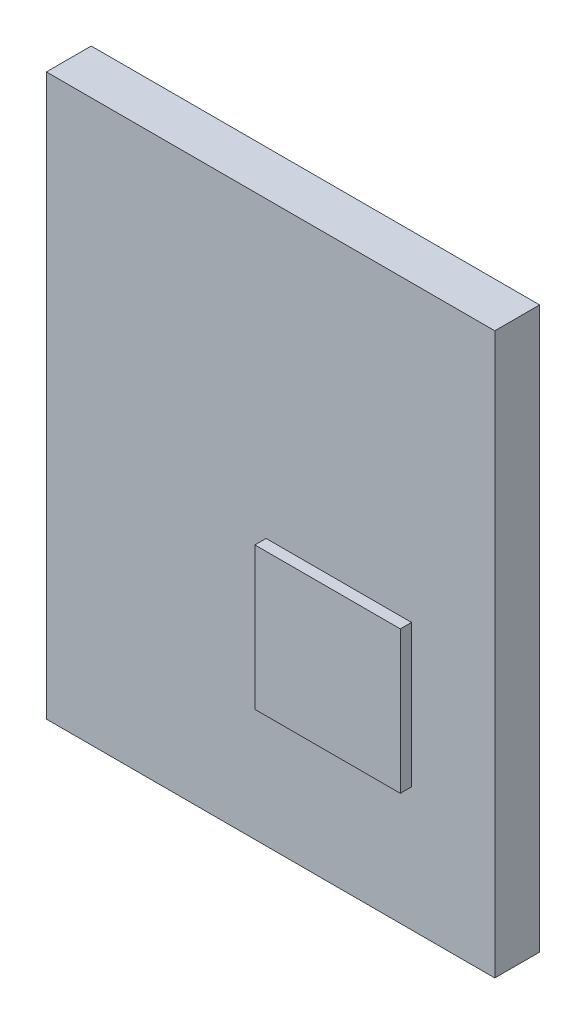
ISO-10303-21;
HEADER;
FILE_DESCRIPTION(('STEP AP214'),'2;1');
FILE_NAME('part.step','',(''),(''),'','','');
FILE_SCHEMA(('AUTOMOTIVE_DESIGN { 1 0 10303 214 1 1 1 1 }'));
ENDSEC;
DATA;
#1=APPLICATION_CONTEXT('core data for automotive mechanical design processes');
#2=APPLICATION_PROTOCOL_DEFINITION('international standard','automotive_design',2000,#1);
#3=PRODUCT_CONTEXT('',#1,'mechanical');
#4=PRODUCT('Part','Part','',(#3));
#5=PRODUCT_RELATED_PRODUCT_CATEGORY('part','',(#4));
#6=PRODUCT_DEFINITION_FORMATION('','',#4);
#7=PRODUCT_DEFINITION_CONTEXT('part definition',#1,'design');
#8=PRODUCT_DEFINITION('design','',#6,#7);
#9=PRODUCT_DEFINITION_SHAPE('','',#8);
#10=(LENGTH_UNIT() NAMED_UNIT(*) SI_UNIT(.MILLI.,.METRE.));
#11=(NAMED_UNIT(*) PLANE_ANGLE_UNIT() SI_UNIT($,.RADIAN.));
#12=(NAMED_UNIT(*) SI_UNIT($,.STERADIAN.) SOLID_ANGLE_UNIT());
#13=UNCERTAINTY_MEASURE_WITH_UNIT(LENGTH_MEASURE(1.E-05),#10,'distance_accuracy_value','');
#14=(GEOMETRIC_REPRESENTATION_CONTEXT(3) GLOBAL_UNCERTAINTY_ASSIGNED_CONTEXT((#13)) GLOBAL_UNIT_ASSIGNED_CONTEXT((#10,
#11,#12)) REPRESENTATION_CONTEXT('',''));
#15=CARTESIAN_POINT('',(0.,0.,0.));
#16=DIRECTION('',(0.,0.,1.));
#17=DIRECTION('',(1.,0.,0.));
#18=AXIS2_PLACEMENT_3D('',#15,#16,#17);
#19=CARTESIAN_POINT('',(0.,0.,2.));
#20=DIRECTION('',(0.,0.,1.));
#21=DIRECTION('',(1.,0.,0.));
#22=AXIS2_PLACEMENT_3D('',#19,#20,#21);
#23=PLANE('',#22);
#24=DIRECTION('',(0.,-1.,0.));
#25=VECTOR('',#24,1.);
#26=CARTESIAN_POINT('',(-10.,-12.5,2.));
#27=LINE('',#26,#25);
#28=CARTESIAN_POINT('',(-10.,12.5,2.));
#29=VERTEX_POINT('',#28);
#30=CARTESIAN_POINT('',(-10.,-12.5,2.));
#31=VERTEX_POINT('',#30);
#32=EDGE_CURVE('E152',#29,#31,#27,.T.);
#33=ORIENTED_EDGE('',*,*,#32,.T.);
#34=DIRECTION('',(1.,0.,0.));
#35=VECTOR('',#34,1.);
#36=CARTESIAN_POINT('',(10.,-12.5,2.));
#37=LINE('',#36,#35);
#38=CARTESIAN_POINT('',(10.,-12.5,2.));
#39=VERTEX_POINT('',#38);
#40=EDGE_CURVE('E92',#31,#39,#37,.T.);
#41=ORIENTED_EDGE('',*,*,#40,.T.);
#42=DIRECTION('',(0.,1.,0.));
#43=VECTOR('',#42,1.);
#44=CARTESIAN_POINT('',(10.,-12.5,2.));
#45=LINE('',#44,#43);
#46=CARTESIAN_POINT('',(10.,12.5,2.));
#47=VERTEX_POINT('',#46);
#48=EDGE_CURVE('E157',#39,#47,#45,.T.);
#49=ORIENTED_EDGE('',*,*,#48,.T.);
#50=DIRECTION('',(-1.,0.,0.));
#51=VECTOR('',#50,1.);
#52=CARTESIAN_POINT('',(10.,12.5,2.));
#53=LINE('',#52,#51);
#54=EDGE_CURVE('E64',#47,#29,#53,.T.);
#55=ORIENTED_EDGE('',*,*,#54,.T.);
#56=EDGE_LOOP('',(#33,#41,#49,#55));
#57=FACE_BOUND('',#56,.T.);
#58=DIRECTION('',(-1.,0.,0.));
#59=VECTOR('',#58,1.);
#60=CARTESIAN_POINT('',(-0.20142888616121,-0.621072398997044,2.));
#61=LINE('',#60,#59);
#62=CARTESIAN_POINT('',(6.28532063916234,-0.621072398997044,2.));
#63=VERTEX_POINT('',#62);
#64=CARTESIAN_POINT('',(-0.20142888616121,-0.621072398997044,2.));
#65=VERTEX_POINT('',#64);
#66=EDGE_CURVE('E287',#63,#65,#61,.T.);
#67=ORIENTED_EDGE('',*,*,#66,.F.);
#68=DIRECTION('',(0.,1.,0.));
#69=VECTOR('',#68,1.);
#70=CARTESIAN_POINT('',(6.28532063916234,-0.621072398997044,2.));
#71=LINE('',#70,#69);
#72=CARTESIAN_POINT('',(6.28532063916234,-6.97332786521325,2.));
#73=VERTEX_POINT('',#72);
#74=EDGE_CURVE('E139',#73,#63,#71,.T.);
#75=ORIENTED_EDGE('',*,*,#74,.F.);
#76=DIRECTION('',(1.,0.,0.));
#77=VECTOR('',#76,1.);
#78=CARTESIAN_POINT('',(-0.20142888616121,-6.97332786521325,2.));
#79=LINE('',#78,#77);
#80=CARTESIAN_POINT('',(-0.20142888616121,-6.97332786521325,2.));
#81=VERTEX_POINT('',#80);
#82=EDGE_CURVE('E135',#81,#73,#79,.T.);
#83=ORIENTED_EDGE('',*,*,#82,.F.);
#84=DIRECTION('',(0.,-1.,0.));
#85=VECTOR('',#84,1.);
#86=CARTESIAN_POINT('',(-0.20142888616121,-0.621072398997044,2.));
#87=LINE('',#86,#85);
#88=EDGE_CURVE('E283',#65,#81,#87,.T.);
#89=ORIENTED_EDGE('',*,*,#88,.F.);
#90=EDGE_LOOP('',(#67,#75,#83,#89));
#91=FACE_BOUND('',#90,.T.);
#92=ADVANCED_FACE('F39',(#57,#91),#23,.T.);
#93=CARTESIAN_POINT('',(-10.,-12.5,2.));
#94=DIRECTION('',(1.,0.,0.));
#95=DIRECTION('',(0.,0.,-1.));
#96=AXIS2_PLACEMENT_3D('',#93,#94,#95);
#97=PLANE('',#96);
#98=DIRECTION('',(0.,-1.,0.));
#99=VECTOR('',#98,1.);
#100=CARTESIAN_POINT('',(-10.,-12.5,0.));
#101=LINE('',#100,#99);
#102=CARTESIAN_POINT('',(-10.,12.5,0.));
#103=VERTEX_POINT('',#102);
#104=CARTESIAN_POINT('',(-10.,-12.5,0.));
#105=VERTEX_POINT('',#104);
#106=EDGE_CURVE('E142',#103,#105,#101,.T.);
#107=ORIENTED_EDGE('',*,*,#106,.T.);
#108=DIRECTION('',(0.,0.,-1.));
#109=VECTOR('',#108,1.);
#110=CARTESIAN_POINT('',(-10.,-12.5,2.));
#111=LINE('',#110,#109);
#112=EDGE_CURVE('E11',#31,#105,#111,.T.);
#113=ORIENTED_EDGE('',*,*,#112,.F.);
#114=ORIENTED_EDGE('',*,*,#32,.F.);
#115=DIRECTION('',(0.,0.,-1.));
#116=VECTOR('',#115,1.);
#117=CARTESIAN_POINT('',(-10.,12.5,2.));
#118=LINE('',#117,#116);
#119=EDGE_CURVE('E161',#29,#103,#118,.T.);
#120=ORIENTED_EDGE('',*,*,#119,.T.);
#121=EDGE_LOOP('',(#107,#113,#114,#120));
#122=FACE_BOUND('',#121,.T.);
#123=ADVANCED_FACE('F41',(#122),#97,.F.);
#124=CARTESIAN_POINT('',(10.,-12.5,2.));
#125=DIRECTION('',(0.,1.,0.));
#126=DIRECTION('',(-1.,0.,0.));
#127=AXIS2_PLACEMENT_3D('',#124,#125,#126);
#128=PLANE('',#127);
#129=DIRECTION('',(1.,0.,0.));
#130=VECTOR('',#129,1.);
#131=CARTESIAN_POINT('',(10.,-12.5,0.));
#132=LINE('',#131,#130);
#133=CARTESIAN_POINT('',(10.,-12.5,0.));
#134=VERTEX_POINT('',#133);
#135=EDGE_CURVE('E147',#105,#134,#132,.T.);
#136=ORIENTED_EDGE('',*,*,#135,.T.);
#137=DIRECTION('',(0.,0.,-1.));
#138=VECTOR('',#137,1.);
#139=CARTESIAN_POINT('',(10.,-12.5,2.));
#140=LINE('',#139,#138);
#141=EDGE_CURVE('E48',#39,#134,#140,.T.);
#142=ORIENTED_EDGE('',*,*,#141,.F.);
#143=ORIENTED_EDGE('',*,*,#40,.F.);
#144=ORIENTED_EDGE('',*,*,#112,.T.);
#145=EDGE_LOOP('',(#136,#142,#143,#144));
#146=FACE_BOUND('',#145,.T.);
#147=ADVANCED_FACE('F195',(#146),#128,.F.);
#148=CARTESIAN_POINT('',(10.,-12.5,2.));
#149=DIRECTION('',(-1.,0.,0.));
#150=DIRECTION('',(0.,0.,1.));
#151=AXIS2_PLACEMENT_3D('',#148,#149,#150);
#152=PLANE('',#151);
#153=DIRECTION('',(0.,1.,0.));
#154=VECTOR('',#153,1.);
#155=CARTESIAN_POINT('',(10.,-12.5,0.));
#156=LINE('',#155,#154);
#157=CARTESIAN_POINT('',(10.,12.5,0.));
#158=VERTEX_POINT('',#157);
#159=EDGE_CURVE('E165',#134,#158,#156,.T.);
#160=ORIENTED_EDGE('',*,*,#159,.T.);
#161=DIRECTION('',(0.,0.,-1.));
#162=VECTOR('',#161,1.);
#163=CARTESIAN_POINT('',(10.,12.5,2.));
#164=LINE('',#163,#162);
#165=EDGE_CURVE('E172',#47,#158,#164,.T.);
#166=ORIENTED_EDGE('',*,*,#165,.F.);
#167=ORIENTED_EDGE('',*,*,#48,.F.);
#168=ORIENTED_EDGE('',*,*,#141,.T.);
#169=EDGE_LOOP('',(#160,#166,#167,#168));
#170=FACE_BOUND('',#169,.T.);
#171=ADVANCED_FACE('F179',(#170),#152,.F.);
#172=CARTESIAN_POINT('',(10.,12.5,2.));
#173=DIRECTION('',(0.,-1.,0.));
#174=DIRECTION('',(1.,0.,0.));
#175=AXIS2_PLACEMENT_3D('',#172,#173,#174);
#176=PLANE('',#175);
#177=DIRECTION('',(-1.,0.,0.));
#178=VECTOR('',#177,1.);
#179=CARTESIAN_POINT('',(10.,12.5,0.));
#180=LINE('',#179,#178);
#181=EDGE_CURVE('E85',#158,#103,#180,.T.);
#182=ORIENTED_EDGE('',*,*,#181,.T.);
#183=ORIENTED_EDGE('',*,*,#119,.F.);
#184=ORIENTED_EDGE('',*,*,#54,.F.);
#185=ORIENTED_EDGE('',*,*,#165,.T.);
#186=EDGE_LOOP('',(#182,#183,#184,#185));
#187=FACE_BOUND('',#186,.T.);
#188=ADVANCED_FACE('F187',(#187),#176,.F.);
#189=CARTESIAN_POINT('',(0.,0.,0.));
#190=DIRECTION('',(0.,0.,1.));
#191=DIRECTION('',(1.,0.,0.));
#192=AXIS2_PLACEMENT_3D('',#189,#190,#191);
#193=PLANE('',#192);
#194=ORIENTED_EDGE('',*,*,#106,.F.);
#195=ORIENTED_EDGE('',*,*,#181,.F.);
#196=ORIENTED_EDGE('',*,*,#159,.F.);
#197=ORIENTED_EDGE('',*,*,#135,.F.);
#198=EDGE_LOOP('',(#194,#195,#196,#197));
#199=FACE_BOUND('',#198,.T.);
#200=ADVANCED_FACE('F183',(#199),#193,.F.);
#201=CARTESIAN_POINT('',(6.28532063916234,-0.621072398997044,2.5));
#202=DIRECTION('',(-1.,0.,0.));
#203=DIRECTION('',(0.,-1.,0.));
#204=AXIS2_PLACEMENT_3D('',#201,#202,#203);
#205=PLANE('',#204);
#206=ORIENTED_EDGE('',*,*,#74,.T.);
#207=DIRECTION('',(0.,0.,-1.));
#208=VECTOR('',#207,1.);
#209=CARTESIAN_POINT('',(6.28532063916234,-0.621072398997044,2.5));
#210=LINE('',#209,#208);
#211=CARTESIAN_POINT('',(6.28532063916234,-0.621072398997044,2.5));
#212=VERTEX_POINT('',#211);
#213=EDGE_CURVE('E118',#212,#63,#210,.T.);
#214=ORIENTED_EDGE('',*,*,#213,.F.);
#215=DIRECTION('',(0.,1.,0.));
#216=VECTOR('',#215,1.);
#217=CARTESIAN_POINT('',(6.28532063916234,-0.621072398997044,2.5));
#218=LINE('',#217,#216);
#219=CARTESIAN_POINT('',(6.28532063916234,-6.97332786521325,2.5));
#220=VERTEX_POINT('',#219);
#221=EDGE_CURVE('E126',#220,#212,#218,.T.);
#222=ORIENTED_EDGE('',*,*,#221,.F.);
#223=DIRECTION('',(0.,0.,-1.));
#224=VECTOR('',#223,1.);
#225=CARTESIAN_POINT('',(6.28532063916234,-6.97332786521325,2.5));
#226=LINE('',#225,#224);
#227=EDGE_CURVE('E280',#220,#73,#226,.T.);
#228=ORIENTED_EDGE('',*,*,#227,.T.);
#229=EDGE_LOOP('',(#206,#214,#222,#228));
#230=FACE_BOUND('',#229,.T.);
#231=ADVANCED_FACE('F137',(#230),#205,.F.);
#232=CARTESIAN_POINT('',(-0.20142888616121,-0.621072398997044,2.5));
#233=DIRECTION('',(0.,-1.,0.));
#234=DIRECTION('',(0.,0.,-1.));
#235=AXIS2_PLACEMENT_3D('',#232,#233,#234);
#236=PLANE('',#235);
#237=ORIENTED_EDGE('',*,*,#66,.T.);
#238=DIRECTION('',(0.,0.,-1.));
#239=VECTOR('',#238,1.);
#240=CARTESIAN_POINT('',(-0.20142888616121,-0.621072398997044,2.5));
#241=LINE('',#240,#239);
#242=CARTESIAN_POINT('',(-0.20142888616121,-0.621072398997044,2.5));
#243=VERTEX_POINT('',#242);
#244=EDGE_CURVE('E121',#243,#65,#241,.T.);
#245=ORIENTED_EDGE('',*,*,#244,.F.);
#246=DIRECTION('',(-1.,0.,0.));
#247=VECTOR('',#246,1.);
#248=CARTESIAN_POINT('',(-0.20142888616121,-0.621072398997044,2.5));
#249=LINE('',#248,#247);
#250=EDGE_CURVE('E114',#212,#243,#249,.T.);
#251=ORIENTED_EDGE('',*,*,#250,.F.);
#252=ORIENTED_EDGE('',*,*,#213,.T.);
#253=EDGE_LOOP('',(#237,#245,#251,#252));
#254=FACE_BOUND('',#253,.T.);
#255=ADVANCED_FACE('F116',(#254),#236,.F.);
#256=CARTESIAN_POINT('',(-0.20142888616121,-0.621072398997044,2.5));
#257=DIRECTION('',(1.,0.,0.));
#258=DIRECTION('',(0.,1.,0.));
#259=AXIS2_PLACEMENT_3D('',#256,#257,#258);
#260=PLANE('',#259);
#261=ORIENTED_EDGE('',*,*,#88,.T.);
#262=DIRECTION('',(0.,0.,-1.));
#263=VECTOR('',#262,1.);
#264=CARTESIAN_POINT('',(-0.20142888616121,-6.97332786521325,2.5));
#265=LINE('',#264,#263);
#266=CARTESIAN_POINT('',(-0.20142888616121,-6.97332786521325,2.5));
#267=VERTEX_POINT('',#266);
#268=EDGE_CURVE('E55',#267,#81,#265,.T.);
#269=ORIENTED_EDGE('',*,*,#268,.F.);
#270=DIRECTION('',(0.,-1.,0.));
#271=VECTOR('',#270,1.);
#272=CARTESIAN_POINT('',(-0.20142888616121,-0.621072398997044,2.5));
#273=LINE('',#272,#271);
#274=EDGE_CURVE('E125',#243,#267,#273,.T.);
#275=ORIENTED_EDGE('',*,*,#274,.F.);
#276=ORIENTED_EDGE('',*,*,#244,.T.);
#277=EDGE_LOOP('',(#261,#269,#275,#276));
#278=FACE_BOUND('',#277,.T.);
#279=ADVANCED_FACE('F208',(#278),#260,.F.);
#280=CARTESIAN_POINT('',(-0.20142888616121,-6.97332786521325,2.5));
#281=DIRECTION('',(0.,1.,0.));
#282=DIRECTION('',(0.,0.,1.));
#283=AXIS2_PLACEMENT_3D('',#280,#281,#282);
#284=PLANE('',#283);
#285=ORIENTED_EDGE('',*,*,#82,.T.);
#286=ORIENTED_EDGE('',*,*,#227,.F.);
#287=DIRECTION('',(1.,0.,0.));
#288=VECTOR('',#287,1.);
#289=CARTESIAN_POINT('',(-0.20142888616121,-6.97332786521325,2.5));
#290=LINE('',#289,#288);
#291=EDGE_CURVE('E130',#267,#220,#290,.T.);
#292=ORIENTED_EDGE('',*,*,#291,.F.);
#293=ORIENTED_EDGE('',*,*,#268,.T.);
#294=EDGE_LOOP('',(#285,#286,#292,#293));
#295=FACE_BOUND('',#294,.T.);
#296=ADVANCED_FACE('F211',(#295),#284,.F.);
#297=CARTESIAN_POINT('',(0.,0.,2.5));
#298=DIRECTION('',(0.,0.,1.));
#299=DIRECTION('',(1.,0.,0.));
#300=AXIS2_PLACEMENT_3D('',#297,#298,#299);
#301=PLANE('',#300);
#302=ORIENTED_EDGE('',*,*,#221,.T.);
#303=ORIENTED_EDGE('',*,*,#250,.T.);
#304=ORIENTED_EDGE('',*,*,#274,.T.);
#305=ORIENTED_EDGE('',*,*,#291,.T.);
#306=EDGE_LOOP('',(#302,#303,#304,#305));
#307=FACE_BOUND('',#306,.T.);
#308=ADVANCED_FACE('F129',(#307),#301,.T.);
#309=CLOSED_SHELL('',(#92,#123,#147,#171,#188,#200,#231,#255,#279,#296,#308));
#310=MANIFOLD_SOLID_BREP('B2',#309);
#311=ADVANCED_BREP_SHAPE_REPRESENTATION('',(#18,#310),#14);
#312=SHAPE_DEFINITION_REPRESENTATION(#9,#311);
ENDSEC;
END-ISO-10303-21;
